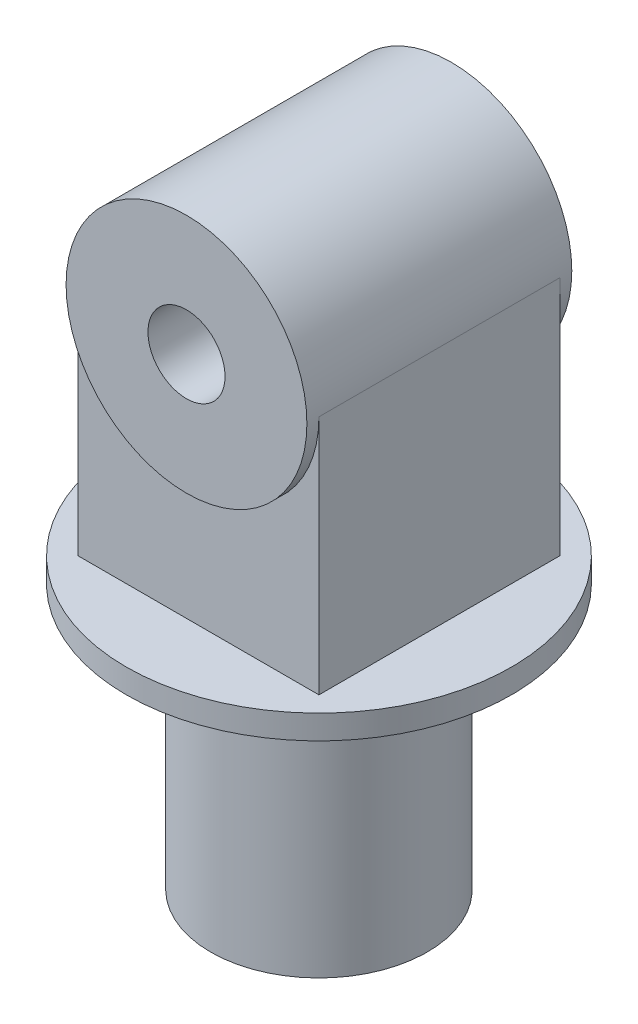
ISO-10303-21;
HEADER;
FILE_DESCRIPTION(('STEP AP214'),'2;1');
FILE_NAME('part.step','',(''),(''),'','','');
FILE_SCHEMA(('AUTOMOTIVE_DESIGN { 1 0 10303 214 1 1 1 1 }'));
ENDSEC;
DATA;
#1=APPLICATION_CONTEXT('core data for automotive mechanical design processes');
#2=APPLICATION_PROTOCOL_DEFINITION('international standard','automotive_design',2000,#1);
#3=PRODUCT_CONTEXT('',#1,'mechanical');
#4=PRODUCT('Part','Part','',(#3));
#5=PRODUCT_RELATED_PRODUCT_CATEGORY('part','',(#4));
#6=PRODUCT_DEFINITION_FORMATION('','',#4);
#7=PRODUCT_DEFINITION_CONTEXT('part definition',#1,'design');
#8=PRODUCT_DEFINITION('design','',#6,#7);
#9=PRODUCT_DEFINITION_SHAPE('','',#8);
#10=(LENGTH_UNIT() NAMED_UNIT(*) SI_UNIT(.MILLI.,.METRE.));
#11=(NAMED_UNIT(*) PLANE_ANGLE_UNIT() SI_UNIT($,.RADIAN.));
#12=(NAMED_UNIT(*) SI_UNIT($,.STERADIAN.) SOLID_ANGLE_UNIT());
#13=UNCERTAINTY_MEASURE_WITH_UNIT(LENGTH_MEASURE(1.E-05),#10,'distance_accuracy_value','');
#14=(GEOMETRIC_REPRESENTATION_CONTEXT(3) GLOBAL_UNCERTAINTY_ASSIGNED_CONTEXT((#13)) GLOBAL_UNIT_ASSIGNED_CONTEXT((#10,
#11,#12)) REPRESENTATION_CONTEXT('',''));
#15=CARTESIAN_POINT('',(0.,0.,0.));
#16=DIRECTION('',(0.,0.,1.));
#17=DIRECTION('',(1.,0.,0.));
#18=AXIS2_PLACEMENT_3D('',#15,#16,#17);
#19=CARTESIAN_POINT('',(0.,60.,0.));
#20=DIRECTION('',(0.,-1.,0.));
#21=DIRECTION('',(0.,0.,-1.));
#22=AXIS2_PLACEMENT_3D('',#19,#20,#21);
#23=CYLINDRICAL_SURFACE('',#22,22.5);
#24=CARTESIAN_POINT('',(0.,0.,0.));
#25=DIRECTION('',(0.,1.,0.));
#26=DIRECTION('',(0.,0.,1.));
#27=AXIS2_PLACEMENT_3D('',#24,#25,#26);
#28=CIRCLE('',#27,22.5);
#29=CARTESIAN_POINT('',(0.,0.,22.5));
#30=VERTEX_POINT('',#29);
#31=EDGE_CURVE('E44',#30,#30,#28,.T.);
#32=ORIENTED_EDGE('',*,*,#31,.T.);
#33=EDGE_LOOP('',(#32));
#34=FACE_BOUND('',#33,.T.);
#35=CARTESIAN_POINT('',(0.,55.,0.));
#36=DIRECTION('',(0.,1.,0.));
#37=DIRECTION('',(0.,0.,1.));
#38=AXIS2_PLACEMENT_3D('',#35,#36,#37);
#39=CIRCLE('',#38,22.5);
#40=CARTESIAN_POINT('',(0.,55.,22.5));
#41=VERTEX_POINT('',#40);
#42=EDGE_CURVE('E11',#41,#41,#39,.T.);
#43=ORIENTED_EDGE('',*,*,#42,.F.);
#44=EDGE_LOOP('',(#43));
#45=FACE_BOUND('',#44,.T.);
#46=ADVANCED_FACE('F36',(#34,#45),#23,.T.);
#47=CARTESIAN_POINT('',(0.,0.,0.));
#48=DIRECTION('',(0.,1.,0.));
#49=DIRECTION('',(0.,0.,1.));
#50=AXIS2_PLACEMENT_3D('',#47,#48,#49);
#51=PLANE('',#50);
#52=ORIENTED_EDGE('',*,*,#31,.F.);
#53=EDGE_LOOP('',(#52));
#54=FACE_BOUND('',#53,.T.);
#55=ADVANCED_FACE('F124',(#54),#51,.F.);
#56=CARTESIAN_POINT('',(0.,55.,0.));
#57=DIRECTION('',(0.,1.,0.));
#58=DIRECTION('',(0.,0.,1.));
#59=AXIS2_PLACEMENT_3D('',#56,#57,#58);
#60=CYLINDRICAL_SURFACE('',#59,40.);
#61=CARTESIAN_POINT('',(0.,55.,0.));
#62=DIRECTION('',(0.,1.,0.));
#63=DIRECTION('',(0.,0.,1.));
#64=AXIS2_PLACEMENT_3D('',#61,#62,#63);
#65=CIRCLE('',#64,40.);
#66=CARTESIAN_POINT('',(0.,55.,40.));
#67=VERTEX_POINT('',#66);
#68=EDGE_CURVE('E114',#67,#67,#65,.T.);
#69=ORIENTED_EDGE('',*,*,#68,.T.);
#70=EDGE_LOOP('',(#69));
#71=FACE_BOUND('',#70,.T.);
#72=CARTESIAN_POINT('',(0.,60.,0.));
#73=DIRECTION('',(0.,1.,0.));
#74=DIRECTION('',(0.,0.,1.));
#75=AXIS2_PLACEMENT_3D('',#72,#73,#74);
#76=CIRCLE('',#75,40.);
#77=CARTESIAN_POINT('',(0.,60.,40.));
#78=VERTEX_POINT('',#77);
#79=EDGE_CURVE('E84',#78,#78,#76,.T.);
#80=ORIENTED_EDGE('',*,*,#79,.F.);
#81=EDGE_LOOP('',(#80));
#82=FACE_BOUND('',#81,.T.);
#83=ADVANCED_FACE('F126',(#71,#82),#60,.T.);
#84=CARTESIAN_POINT('',(0.,55.,0.));
#85=DIRECTION('',(0.,1.,0.));
#86=DIRECTION('',(0.,0.,1.));
#87=AXIS2_PLACEMENT_3D('',#84,#85,#86);
#88=PLANE('',#87);
#89=ORIENTED_EDGE('',*,*,#42,.T.);
#90=EDGE_LOOP('',(#89));
#91=FACE_BOUND('',#90,.T.);
#92=ORIENTED_EDGE('',*,*,#68,.F.);
#93=EDGE_LOOP('',(#92));
#94=FACE_BOUND('',#93,.T.);
#95=ADVANCED_FACE('F131',(#91,#94),#88,.F.);
#96=CARTESIAN_POINT('',(0.,60.,0.));
#97=DIRECTION('',(0.,1.,0.));
#98=DIRECTION('',(0.,0.,1.));
#99=AXIS2_PLACEMENT_3D('',#96,#97,#98);
#100=PLANE('',#99);
#101=DIRECTION('',(0.,0.,-1.));
#102=VECTOR('',#101,1.);
#103=CARTESIAN_POINT('',(25.,60.,25.));
#104=LINE('',#103,#102);
#105=CARTESIAN_POINT('',(25.,60.,25.));
#106=VERTEX_POINT('',#105);
#107=CARTESIAN_POINT('',(25.,60.,-25.));
#108=VERTEX_POINT('',#107);
#109=EDGE_CURVE('E51',#106,#108,#104,.T.);
#110=ORIENTED_EDGE('',*,*,#109,.F.);
#111=DIRECTION('',(1.,0.,0.));
#112=VECTOR('',#111,1.);
#113=CARTESIAN_POINT('',(-25.,60.,25.));
#114=LINE('',#113,#112);
#115=CARTESIAN_POINT('',(-25.,60.,25.));
#116=VERTEX_POINT('',#115);
#117=EDGE_CURVE('E55',#116,#106,#114,.T.);
#118=ORIENTED_EDGE('',*,*,#117,.F.);
#119=DIRECTION('',(0.,0.,1.));
#120=VECTOR('',#119,1.);
#121=CARTESIAN_POINT('',(-25.,60.,25.));
#122=LINE('',#121,#120);
#123=CARTESIAN_POINT('',(-25.,60.,-25.));
#124=VERTEX_POINT('',#123);
#125=EDGE_CURVE('E101',#124,#116,#122,.T.);
#126=ORIENTED_EDGE('',*,*,#125,.F.);
#127=DIRECTION('',(-1.,0.,0.));
#128=VECTOR('',#127,1.);
#129=CARTESIAN_POINT('',(-25.,60.,-25.));
#130=LINE('',#129,#128);
#131=EDGE_CURVE('E106',#108,#124,#130,.T.);
#132=ORIENTED_EDGE('',*,*,#131,.F.);
#133=EDGE_LOOP('',(#110,#118,#126,#132));
#134=FACE_BOUND('',#133,.T.);
#135=ORIENTED_EDGE('',*,*,#79,.T.);
#136=EDGE_LOOP('',(#135));
#137=FACE_BOUND('',#136,.T.);
#138=ADVANCED_FACE('F135',(#134,#137),#100,.T.);
#139=CARTESIAN_POINT('',(25.,110.,25.));
#140=DIRECTION('',(-1.,0.,0.));
#141=DIRECTION('',(0.,0.,1.));
#142=AXIS2_PLACEMENT_3D('',#139,#140,#141);
#143=PLANE('',#142);
#144=ORIENTED_EDGE('',*,*,#109,.T.);
#145=DIRECTION('',(0.,-1.,0.));
#146=VECTOR('',#145,1.);
#147=CARTESIAN_POINT('',(25.,110.,-25.));
#148=LINE('',#147,#146);
#149=CARTESIAN_POINT('',(25.,110.,-25.));
#150=VERTEX_POINT('',#149);
#151=EDGE_CURVE('E75',#150,#108,#148,.T.);
#152=ORIENTED_EDGE('',*,*,#151,.F.);
#153=DIRECTION('',(0.,0.,-1.));
#154=VECTOR('',#153,1.);
#155=CARTESIAN_POINT('',(25.,110.,25.));
#156=LINE('',#155,#154);
#157=CARTESIAN_POINT('',(25.,110.,25.));
#158=VERTEX_POINT('',#157);
#159=EDGE_CURVE('E80',#158,#150,#156,.T.);
#160=ORIENTED_EDGE('',*,*,#159,.F.);
#161=DIRECTION('',(0.,-1.,0.));
#162=VECTOR('',#161,1.);
#163=CARTESIAN_POINT('',(25.,110.,25.));
#164=LINE('',#163,#162);
#165=EDGE_CURVE('E99',#158,#106,#164,.T.);
#166=ORIENTED_EDGE('',*,*,#165,.T.);
#167=EDGE_LOOP('',(#144,#152,#160,#166));
#168=FACE_BOUND('',#167,.T.);
#169=ADVANCED_FACE('F77',(#168),#143,.F.);
#170=CARTESIAN_POINT('',(-25.,110.,-25.));
#171=DIRECTION('',(0.,0.,1.));
#172=DIRECTION('',(1.,0.,0.));
#173=AXIS2_PLACEMENT_3D('',#170,#171,#172);
#174=PLANE('',#173);
#175=CARTESIAN_POINT('',(0.,110.,-25.));
#176=DIRECTION('',(0.,0.,1.));
#177=DIRECTION('',(1.,0.,0.));
#178=AXIS2_PLACEMENT_3D('',#175,#176,#177);
#179=CIRCLE('',#178,25.);
#180=CARTESIAN_POINT('',(-25.,110.,-25.));
#181=VERTEX_POINT('',#180);
#182=EDGE_CURVE('E88',#150,#181,#179,.F.);
#183=ORIENTED_EDGE('',*,*,#182,.F.);
#184=ORIENTED_EDGE('',*,*,#151,.T.);
#185=ORIENTED_EDGE('',*,*,#131,.T.);
#186=DIRECTION('',(0.,-1.,0.));
#187=VECTOR('',#186,1.);
#188=CARTESIAN_POINT('',(-25.,110.,-25.));
#189=LINE('',#188,#187);
#190=EDGE_CURVE('E85',#181,#124,#189,.T.);
#191=ORIENTED_EDGE('',*,*,#190,.F.);
#192=EDGE_LOOP('',(#183,#184,#185,#191));
#193=FACE_BOUND('',#192,.T.);
#194=ADVANCED_FACE('F89',(#193),#174,.F.);
#195=CARTESIAN_POINT('',(-25.,110.,25.));
#196=DIRECTION('',(1.,0.,0.));
#197=DIRECTION('',(0.,0.,-1.));
#198=AXIS2_PLACEMENT_3D('',#195,#196,#197);
#199=PLANE('',#198);
#200=ORIENTED_EDGE('',*,*,#125,.T.);
#201=DIRECTION('',(0.,-1.,0.));
#202=VECTOR('',#201,1.);
#203=CARTESIAN_POINT('',(-25.,110.,25.));
#204=LINE('',#203,#202);
#205=CARTESIAN_POINT('',(-25.,110.,25.));
#206=VERTEX_POINT('',#205);
#207=EDGE_CURVE('E110',#206,#116,#204,.T.);
#208=ORIENTED_EDGE('',*,*,#207,.F.);
#209=DIRECTION('',(0.,0.,1.));
#210=VECTOR('',#209,1.);
#211=CARTESIAN_POINT('',(-25.,110.,25.));
#212=LINE('',#211,#210);
#213=EDGE_CURVE('E97',#181,#206,#212,.T.);
#214=ORIENTED_EDGE('',*,*,#213,.F.);
#215=ORIENTED_EDGE('',*,*,#190,.T.);
#216=EDGE_LOOP('',(#200,#208,#214,#215));
#217=FACE_BOUND('',#216,.T.);
#218=ADVANCED_FACE('F145',(#217),#199,.F.);
#219=CARTESIAN_POINT('',(-25.,110.,25.));
#220=DIRECTION('',(0.,0.,-1.));
#221=DIRECTION('',(-1.,0.,0.));
#222=AXIS2_PLACEMENT_3D('',#219,#220,#221);
#223=PLANE('',#222);
#224=CARTESIAN_POINT('',(0.,110.,25.));
#225=DIRECTION('',(0.,0.,-1.));
#226=DIRECTION('',(-1.,0.,0.));
#227=AXIS2_PLACEMENT_3D('',#224,#225,#226);
#228=CIRCLE('',#227,25.);
#229=EDGE_CURVE('E94',#206,#158,#228,.F.);
#230=ORIENTED_EDGE('',*,*,#229,.F.);
#231=ORIENTED_EDGE('',*,*,#207,.T.);
#232=ORIENTED_EDGE('',*,*,#117,.T.);
#233=ORIENTED_EDGE('',*,*,#165,.F.);
#234=EDGE_LOOP('',(#230,#231,#232,#233));
#235=FACE_BOUND('',#234,.T.);
#236=ADVANCED_FACE('F148',(#235),#223,.F.);
#237=CARTESIAN_POINT('',(0.,110.,27.5));
#238=DIRECTION('',(0.,0.,-1.));
#239=DIRECTION('',(-1.,0.,0.));
#240=AXIS2_PLACEMENT_3D('',#237,#238,#239);
#241=CYLINDRICAL_SURFACE('',#240,25.);
#242=CARTESIAN_POINT('',(0.,110.,27.5));
#243=DIRECTION('',(0.,0.,1.));
#244=DIRECTION('',(1.,0.,0.));
#245=AXIS2_PLACEMENT_3D('',#242,#243,#244);
#246=CIRCLE('',#245,25.);
#247=CARTESIAN_POINT('',(25.,110.,27.5));
#248=VERTEX_POINT('',#247);
#249=EDGE_CURVE('E177',#248,#248,#246,.T.);
#250=ORIENTED_EDGE('',*,*,#249,.F.);
#251=EDGE_LOOP('',(#250));
#252=FACE_BOUND('',#251,.T.);
#253=CARTESIAN_POINT('',(0.,110.,-27.5));
#254=DIRECTION('',(0.,0.,1.));
#255=DIRECTION('',(1.,0.,0.));
#256=AXIS2_PLACEMENT_3D('',#253,#254,#255);
#257=CIRCLE('',#256,25.);
#258=CARTESIAN_POINT('',(25.,110.,-27.5));
#259=VERTEX_POINT('',#258);
#260=EDGE_CURVE('E175',#259,#259,#257,.T.);
#261=ORIENTED_EDGE('',*,*,#260,.T.);
#262=EDGE_LOOP('',(#261));
#263=FACE_BOUND('',#262,.T.);
#264=ORIENTED_EDGE('',*,*,#159,.T.);
#265=ORIENTED_EDGE('',*,*,#182,.T.);
#266=ORIENTED_EDGE('',*,*,#213,.T.);
#267=ORIENTED_EDGE('',*,*,#229,.T.);
#268=EDGE_LOOP('',(#264,#265,#266,#267));
#269=FACE_BOUND('',#268,.T.);
#270=ADVANCED_FACE('F96',(#252,#263,#269),#241,.T.);
#271=CARTESIAN_POINT('',(0.,110.,27.5));
#272=DIRECTION('',(0.,0.,1.));
#273=DIRECTION('',(1.,0.,0.));
#274=AXIS2_PLACEMENT_3D('',#271,#272,#273);
#275=PLANE('',#274);
#276=CARTESIAN_POINT('',(0.,110.,27.5));
#277=DIRECTION('',(0.,0.,1.));
#278=DIRECTION('',(1.,0.,0.));
#279=AXIS2_PLACEMENT_3D('',#276,#277,#278);
#280=CIRCLE('',#279,8.);
#281=CARTESIAN_POINT('',(8.,110.,27.5));
#282=VERTEX_POINT('',#281);
#283=EDGE_CURVE('E172',#282,#282,#280,.T.);
#284=ORIENTED_EDGE('',*,*,#283,.F.);
#285=EDGE_LOOP('',(#284));
#286=FACE_BOUND('',#285,.T.);
#287=ORIENTED_EDGE('',*,*,#249,.T.);
#288=EDGE_LOOP('',(#287));
#289=FACE_BOUND('',#288,.T.);
#290=ADVANCED_FACE('F155',(#286,#289),#275,.T.);
#291=CARTESIAN_POINT('',(0.,110.,-27.5));
#292=DIRECTION('',(0.,0.,1.));
#293=DIRECTION('',(1.,0.,0.));
#294=AXIS2_PLACEMENT_3D('',#291,#292,#293);
#295=PLANE('',#294);
#296=CARTESIAN_POINT('',(0.,110.,-27.5));
#297=DIRECTION('',(0.,0.,1.));
#298=DIRECTION('',(1.,0.,0.));
#299=AXIS2_PLACEMENT_3D('',#296,#297,#298);
#300=CIRCLE('',#299,8.);
#301=CARTESIAN_POINT('',(8.,110.,-27.5));
#302=VERTEX_POINT('',#301);
#303=EDGE_CURVE('E39',#302,#302,#300,.T.);
#304=ORIENTED_EDGE('',*,*,#303,.T.);
#305=EDGE_LOOP('',(#304));
#306=FACE_BOUND('',#305,.T.);
#307=ORIENTED_EDGE('',*,*,#260,.F.);
#308=EDGE_LOOP('',(#307));
#309=FACE_BOUND('',#308,.T.);
#310=ADVANCED_FACE('F157',(#306,#309),#295,.F.);
#311=CARTESIAN_POINT('',(0.,110.,-40.));
#312=DIRECTION('',(0.,0.,1.));
#313=DIRECTION('',(1.,0.,0.));
#314=AXIS2_PLACEMENT_3D('',#311,#312,#313);
#315=CYLINDRICAL_SURFACE('',#314,8.);
#316=ORIENTED_EDGE('',*,*,#283,.T.);
#317=EDGE_LOOP('',(#316));
#318=FACE_BOUND('',#317,.T.);
#319=ORIENTED_EDGE('',*,*,#303,.F.);
#320=EDGE_LOOP('',(#319));
#321=FACE_BOUND('',#320,.T.);
#322=ADVANCED_FACE('F160',(#318,#321),#315,.F.);
#323=CLOSED_SHELL('',(#46,#55,#83,#95,#138,#169,#194,#218,#236,#270,#290,#310,#322));
#324=MANIFOLD_SOLID_BREP('B2',#323);
#325=ADVANCED_BREP_SHAPE_REPRESENTATION('',(#18,#324),#14);
#326=SHAPE_DEFINITION_REPRESENTATION(#9,#325);
ENDSEC;
END-ISO-10303-21;
